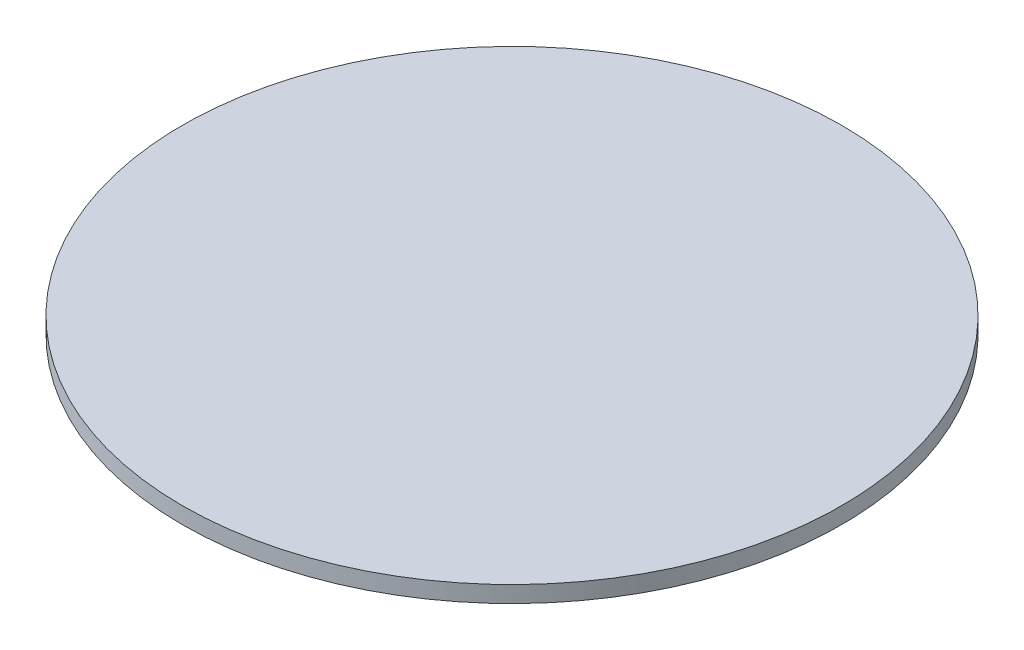
ISO-10303-21;
HEADER;
FILE_DESCRIPTION(('STEP AP214'),'2;1');
FILE_NAME('part.step','',(''),(''),'','','');
FILE_SCHEMA(('AUTOMOTIVE_DESIGN { 1 0 10303 214 1 1 1 1 }'));
ENDSEC;
DATA;
#1=APPLICATION_CONTEXT('core data for automotive mechanical design processes');
#2=APPLICATION_PROTOCOL_DEFINITION('international standard','automotive_design',2000,#1);
#3=PRODUCT_CONTEXT('',#1,'mechanical');
#4=PRODUCT('Part','Part','',(#3));
#5=PRODUCT_RELATED_PRODUCT_CATEGORY('part','',(#4));
#6=PRODUCT_DEFINITION_FORMATION('','',#4);
#7=PRODUCT_DEFINITION_CONTEXT('part definition',#1,'design');
#8=PRODUCT_DEFINITION('design','',#6,#7);
#9=PRODUCT_DEFINITION_SHAPE('','',#8);
#10=(LENGTH_UNIT() NAMED_UNIT(*) SI_UNIT(.MILLI.,.METRE.));
#11=(NAMED_UNIT(*) PLANE_ANGLE_UNIT() SI_UNIT($,.RADIAN.));
#12=(NAMED_UNIT(*) SI_UNIT($,.STERADIAN.) SOLID_ANGLE_UNIT());
#13=UNCERTAINTY_MEASURE_WITH_UNIT(LENGTH_MEASURE(1.E-05),#10,'distance_accuracy_value','');
#14=(GEOMETRIC_REPRESENTATION_CONTEXT(3) GLOBAL_UNCERTAINTY_ASSIGNED_CONTEXT((#13)) GLOBAL_UNIT_ASSIGNED_CONTEXT((#10,
#11,#12)) REPRESENTATION_CONTEXT('',''));
#15=CARTESIAN_POINT('',(0.,0.,0.));
#16=DIRECTION('',(0.,0.,1.));
#17=DIRECTION('',(1.,0.,0.));
#18=AXIS2_PLACEMENT_3D('',#15,#16,#17);
#19=CARTESIAN_POINT('',(0.,1.5,0.));
#20=DIRECTION('',(0.,-1.,0.));
#21=DIRECTION('',(0.,0.,-1.));
#22=AXIS2_PLACEMENT_3D('',#19,#20,#21);
#23=CYLINDRICAL_SURFACE('',#22,30.);
#24=CARTESIAN_POINT('',(0.,1.5,0.));
#25=DIRECTION('',(0.,1.,0.));
#26=DIRECTION('',(0.,0.,1.));
#27=AXIS2_PLACEMENT_3D('',#24,#25,#26);
#28=CIRCLE('',#27,30.);
#29=CARTESIAN_POINT('',(0.,1.5,30.));
#30=VERTEX_POINT('',#29);
#31=EDGE_CURVE('E10',#30,#30,#28,.T.);
#32=ORIENTED_EDGE('',*,*,#31,.F.);
#33=EDGE_LOOP('',(#32));
#34=FACE_BOUND('',#33,.T.);
#35=CARTESIAN_POINT('',(0.,0.,0.));
#36=DIRECTION('',(0.,1.,0.));
#37=DIRECTION('',(0.,0.,1.));
#38=AXIS2_PLACEMENT_3D('',#35,#36,#37);
#39=CIRCLE('',#38,30.);
#40=CARTESIAN_POINT('',(0.,0.,30.));
#41=VERTEX_POINT('',#40);
#42=EDGE_CURVE('E37',#41,#41,#39,.T.);
#43=ORIENTED_EDGE('',*,*,#42,.T.);
#44=EDGE_LOOP('',(#43));
#45=FACE_BOUND('',#44,.T.);
#46=ADVANCED_FACE('F34',(#34,#45),#23,.T.);
#47=CARTESIAN_POINT('',(0.,1.5,0.));
#48=DIRECTION('',(0.,1.,0.));
#49=DIRECTION('',(0.,0.,1.));
#50=AXIS2_PLACEMENT_3D('',#47,#48,#49);
#51=PLANE('',#50);
#52=ORIENTED_EDGE('',*,*,#31,.T.);
#53=EDGE_LOOP('',(#52));
#54=FACE_BOUND('',#53,.T.);
#55=ADVANCED_FACE('F49',(#54),#51,.T.);
#56=CARTESIAN_POINT('',(0.,0.,0.));
#57=DIRECTION('',(0.,1.,0.));
#58=DIRECTION('',(0.,0.,1.));
#59=AXIS2_PLACEMENT_3D('',#56,#57,#58);
#60=PLANE('',#59);
#61=ORIENTED_EDGE('',*,*,#42,.F.);
#62=EDGE_LOOP('',(#61));
#63=FACE_BOUND('',#62,.T.);
#64=ADVANCED_FACE('F47',(#63),#60,.F.);
#65=CLOSED_SHELL('',(#46,#55,#64));
#66=MANIFOLD_SOLID_BREP('B2',#65);
#67=ADVANCED_BREP_SHAPE_REPRESENTATION('',(#18,#66),#14);
#68=SHAPE_DEFINITION_REPRESENTATION(#9,#67);
ENDSEC;
END-ISO-10303-21;
